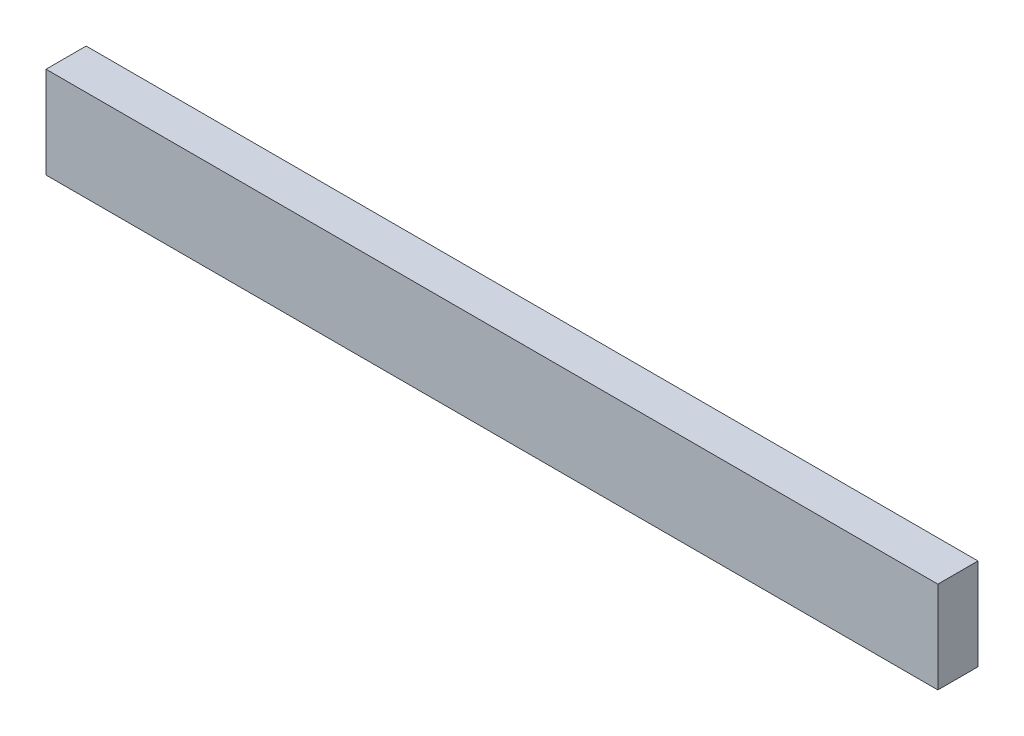
ISO-10303-21;
HEADER;
FILE_DESCRIPTION(('STEP AP214'),'2;1');
FILE_NAME('part.step','',(''),(''),'','','');
FILE_SCHEMA(('AUTOMOTIVE_DESIGN { 1 0 10303 214 1 1 1 1 }'));
ENDSEC;
DATA;
#1=APPLICATION_CONTEXT('core data for automotive mechanical design processes');
#2=APPLICATION_PROTOCOL_DEFINITION('international standard','automotive_design',2000,#1);
#3=PRODUCT_CONTEXT('',#1,'mechanical');
#4=PRODUCT('Part','Part','',(#3));
#5=PRODUCT_RELATED_PRODUCT_CATEGORY('part','',(#4));
#6=PRODUCT_DEFINITION_FORMATION('','',#4);
#7=PRODUCT_DEFINITION_CONTEXT('part definition',#1,'design');
#8=PRODUCT_DEFINITION('design','',#6,#7);
#9=PRODUCT_DEFINITION_SHAPE('','',#8);
#10=(LENGTH_UNIT() NAMED_UNIT(*) SI_UNIT(.MILLI.,.METRE.));
#11=(NAMED_UNIT(*) PLANE_ANGLE_UNIT() SI_UNIT($,.RADIAN.));
#12=(NAMED_UNIT(*) SI_UNIT($,.STERADIAN.) SOLID_ANGLE_UNIT());
#13=UNCERTAINTY_MEASURE_WITH_UNIT(LENGTH_MEASURE(1.E-05),#10,'distance_accuracy_value','');
#14=(GEOMETRIC_REPRESENTATION_CONTEXT(3) GLOBAL_UNCERTAINTY_ASSIGNED_CONTEXT((#13)) GLOBAL_UNIT_ASSIGNED_CONTEXT((#10,
#11,#12)) REPRESENTATION_CONTEXT('',''));
#15=CARTESIAN_POINT('',(0.,0.,0.));
#16=DIRECTION('',(0.,0.,1.));
#17=DIRECTION('',(1.,0.,0.));
#18=AXIS2_PLACEMENT_3D('',#15,#16,#17);
#19=CARTESIAN_POINT('',(0.,0.,18.));
#20=DIRECTION('',(-1.,0.,0.));
#21=DIRECTION('',(0.,0.,1.));
#22=AXIS2_PLACEMENT_3D('',#19,#20,#21);
#23=PLANE('',#22);
#24=DIRECTION('',(0.,1.,0.));
#25=VECTOR('',#24,1.);
#26=CARTESIAN_POINT('',(0.,0.,0.));
#27=LINE('',#26,#25);
#28=CARTESIAN_POINT('',(0.,0.,0.));
#29=VERTEX_POINT('',#28);
#30=CARTESIAN_POINT('',(0.,41.1073073381211,0.));
#31=VERTEX_POINT('',#30);
#32=EDGE_CURVE('E104',#29,#31,#27,.T.);
#33=ORIENTED_EDGE('',*,*,#32,.T.);
#34=DIRECTION('',(0.,0.,-1.));
#35=VECTOR('',#34,1.);
#36=CARTESIAN_POINT('',(0.,41.1073073381211,18.));
#37=LINE('',#36,#35);
#38=CARTESIAN_POINT('',(0.,41.1073073381211,18.));
#39=VERTEX_POINT('',#38);
#40=EDGE_CURVE('E11',#39,#31,#37,.T.);
#41=ORIENTED_EDGE('',*,*,#40,.F.);
#42=DIRECTION('',(0.,1.,0.));
#43=VECTOR('',#42,1.);
#44=CARTESIAN_POINT('',(0.,0.,18.));
#45=LINE('',#44,#43);
#46=CARTESIAN_POINT('',(0.,0.,18.));
#47=VERTEX_POINT('',#46);
#48=EDGE_CURVE('E92',#47,#39,#45,.T.);
#49=ORIENTED_EDGE('',*,*,#48,.F.);
#50=DIRECTION('',(0.,0.,-1.));
#51=VECTOR('',#50,1.);
#52=CARTESIAN_POINT('',(0.,0.,18.));
#53=LINE('',#52,#51);
#54=EDGE_CURVE('E100',#47,#29,#53,.T.);
#55=ORIENTED_EDGE('',*,*,#54,.T.);
#56=EDGE_LOOP('',(#33,#41,#49,#55));
#57=FACE_BOUND('',#56,.T.);
#58=ADVANCED_FACE('F41',(#57),#23,.F.);
#59=CARTESIAN_POINT('',(0.,41.1073073381211,18.));
#60=DIRECTION('',(0.,-1.,0.));
#61=DIRECTION('',(1.,0.,0.));
#62=AXIS2_PLACEMENT_3D('',#59,#60,#61);
#63=PLANE('',#62);
#64=DIRECTION('',(-1.,0.,0.));
#65=VECTOR('',#64,1.);
#66=CARTESIAN_POINT('',(0.,41.1073073381211,0.));
#67=LINE('',#66,#65);
#68=CARTESIAN_POINT('',(-400.,41.1073073381211,0.));
#69=VERTEX_POINT('',#68);
#70=EDGE_CURVE('E96',#31,#69,#67,.T.);
#71=ORIENTED_EDGE('',*,*,#70,.T.);
#72=DIRECTION('',(0.,0.,-1.));
#73=VECTOR('',#72,1.);
#74=CARTESIAN_POINT('',(-400.,41.1073073381211,18.));
#75=LINE('',#74,#73);
#76=CARTESIAN_POINT('',(-400.,41.1073073381211,18.));
#77=VERTEX_POINT('',#76);
#78=EDGE_CURVE('E49',#77,#69,#75,.T.);
#79=ORIENTED_EDGE('',*,*,#78,.F.);
#80=DIRECTION('',(-1.,0.,0.));
#81=VECTOR('',#80,1.);
#82=CARTESIAN_POINT('',(0.,41.1073073381211,18.));
#83=LINE('',#82,#81);
#84=EDGE_CURVE('E87',#39,#77,#83,.T.);
#85=ORIENTED_EDGE('',*,*,#84,.F.);
#86=ORIENTED_EDGE('',*,*,#40,.T.);
#87=EDGE_LOOP('',(#71,#79,#85,#86));
#88=FACE_BOUND('',#87,.T.);
#89=ADVANCED_FACE('F95',(#88),#63,.F.);
#90=CARTESIAN_POINT('',(-400.,0.,18.));
#91=DIRECTION('',(1.,0.,0.));
#92=DIRECTION('',(0.,0.,-1.));
#93=AXIS2_PLACEMENT_3D('',#90,#91,#92);
#94=PLANE('',#93);
#95=DIRECTION('',(0.,-1.,0.));
#96=VECTOR('',#95,1.);
#97=CARTESIAN_POINT('',(-400.,0.,0.));
#98=LINE('',#97,#96);
#99=CARTESIAN_POINT('',(-400.,0.,0.));
#100=VERTEX_POINT('',#99);
#101=EDGE_CURVE('E74',#69,#100,#98,.T.);
#102=ORIENTED_EDGE('',*,*,#101,.T.);
#103=DIRECTION('',(0.,0.,-1.));
#104=VECTOR('',#103,1.);
#105=CARTESIAN_POINT('',(-400.,0.,18.));
#106=LINE('',#105,#104);
#107=CARTESIAN_POINT('',(-400.,0.,18.));
#108=VERTEX_POINT('',#107);
#109=EDGE_CURVE('E97',#108,#100,#106,.T.);
#110=ORIENTED_EDGE('',*,*,#109,.F.);
#111=DIRECTION('',(0.,-1.,0.));
#112=VECTOR('',#111,1.);
#113=CARTESIAN_POINT('',(-400.,0.,18.));
#114=LINE('',#113,#112);
#115=EDGE_CURVE('E90',#77,#108,#114,.T.);
#116=ORIENTED_EDGE('',*,*,#115,.F.);
#117=ORIENTED_EDGE('',*,*,#78,.T.);
#118=EDGE_LOOP('',(#102,#110,#116,#117));
#119=FACE_BOUND('',#118,.T.);
#120=ADVANCED_FACE('F98',(#119),#94,.F.);
#121=CARTESIAN_POINT('',(0.,0.,18.));
#122=DIRECTION('',(0.,1.,0.));
#123=DIRECTION('',(-1.,0.,0.));
#124=AXIS2_PLACEMENT_3D('',#121,#122,#123);
#125=PLANE('',#124);
#126=DIRECTION('',(1.,0.,0.));
#127=VECTOR('',#126,1.);
#128=CARTESIAN_POINT('',(0.,0.,0.));
#129=LINE('',#128,#127);
#130=EDGE_CURVE('E80',#100,#29,#129,.T.);
#131=ORIENTED_EDGE('',*,*,#130,.T.);
#132=ORIENTED_EDGE('',*,*,#54,.F.);
#133=DIRECTION('',(1.,0.,0.));
#134=VECTOR('',#133,1.);
#135=CARTESIAN_POINT('',(0.,0.,18.));
#136=LINE('',#135,#134);
#137=EDGE_CURVE('E57',#108,#47,#136,.T.);
#138=ORIENTED_EDGE('',*,*,#137,.F.);
#139=ORIENTED_EDGE('',*,*,#109,.T.);
#140=EDGE_LOOP('',(#131,#132,#138,#139));
#141=FACE_BOUND('',#140,.T.);
#142=ADVANCED_FACE('F111',(#141),#125,.F.);
#143=CARTESIAN_POINT('',(0.,0.,18.));
#144=DIRECTION('',(0.,0.,1.));
#145=DIRECTION('',(1.,0.,0.));
#146=AXIS2_PLACEMENT_3D('',#143,#144,#145);
#147=PLANE('',#146);
#148=ORIENTED_EDGE('',*,*,#48,.T.);
#149=ORIENTED_EDGE('',*,*,#84,.T.);
#150=ORIENTED_EDGE('',*,*,#115,.T.);
#151=ORIENTED_EDGE('',*,*,#137,.T.);
#152=EDGE_LOOP('',(#148,#149,#150,#151));
#153=FACE_BOUND('',#152,.T.);
#154=ADVANCED_FACE('F88',(#153),#147,.T.);
#155=CARTESIAN_POINT('',(0.,0.,0.));
#156=DIRECTION('',(0.,0.,1.));
#157=DIRECTION('',(1.,0.,0.));
#158=AXIS2_PLACEMENT_3D('',#155,#156,#157);
#159=PLANE('',#158);
#160=ORIENTED_EDGE('',*,*,#32,.F.);
#161=ORIENTED_EDGE('',*,*,#130,.F.);
#162=ORIENTED_EDGE('',*,*,#101,.F.);
#163=ORIENTED_EDGE('',*,*,#70,.F.);
#164=EDGE_LOOP('',(#160,#161,#162,#163));
#165=FACE_BOUND('',#164,.T.);
#166=ADVANCED_FACE('F114',(#165),#159,.F.);
#167=CLOSED_SHELL('',(#58,#89,#120,#142,#154,#166));
#168=MANIFOLD_SOLID_BREP('B2',#167);
#169=ADVANCED_BREP_SHAPE_REPRESENTATION('',(#18,#168),#14);
#170=SHAPE_DEFINITION_REPRESENTATION(#9,#169);
ENDSEC;
END-ISO-10303-21;
